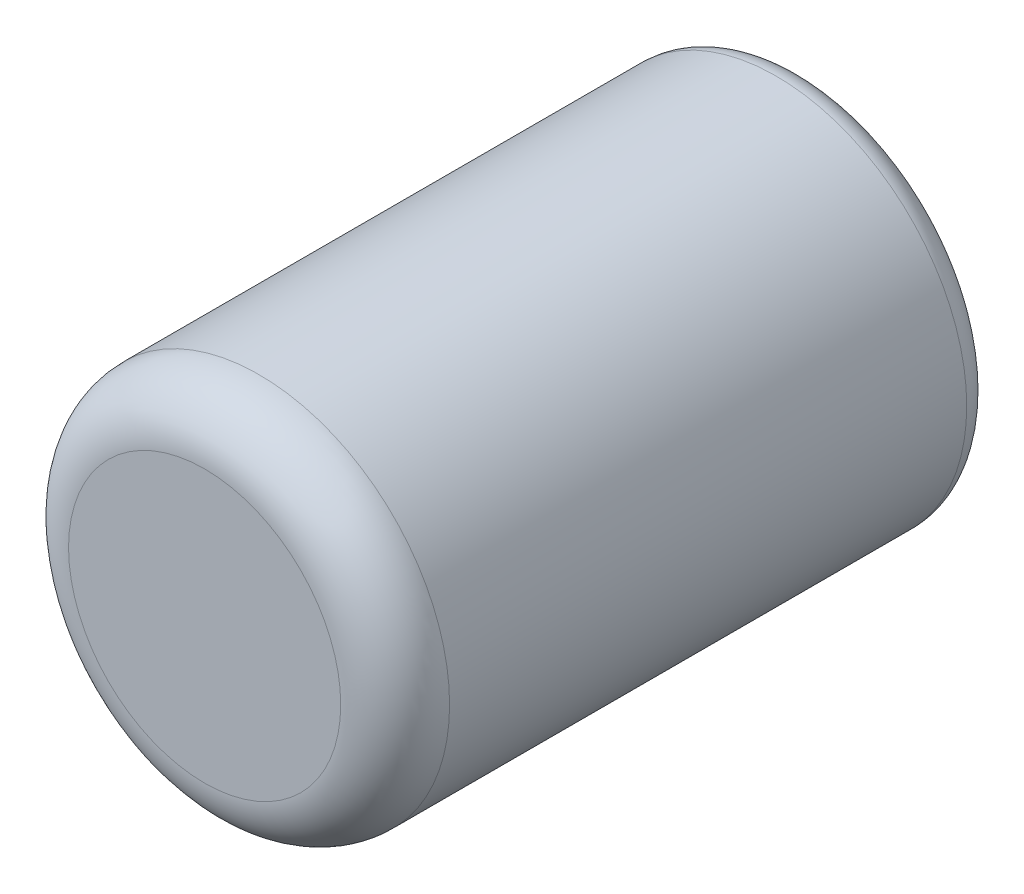
ISO-10303-21;
HEADER;
FILE_DESCRIPTION(('STEP AP214'),'2;1');
FILE_NAME('part.step','',(''),(''),'','','');
FILE_SCHEMA(('AUTOMOTIVE_DESIGN { 1 0 10303 214 1 1 1 1 }'));
ENDSEC;
DATA;
#1=APPLICATION_CONTEXT('core data for automotive mechanical design processes');
#2=APPLICATION_PROTOCOL_DEFINITION('international standard','automotive_design',2000,#1);
#3=PRODUCT_CONTEXT('',#1,'mechanical');
#4=PRODUCT('Part','Part','',(#3));
#5=PRODUCT_RELATED_PRODUCT_CATEGORY('part','',(#4));
#6=PRODUCT_DEFINITION_FORMATION('','',#4);
#7=PRODUCT_DEFINITION_CONTEXT('part definition',#1,'design');
#8=PRODUCT_DEFINITION('design','',#6,#7);
#9=PRODUCT_DEFINITION_SHAPE('','',#8);
#10=(LENGTH_UNIT() NAMED_UNIT(*) SI_UNIT(.MILLI.,.METRE.));
#11=(NAMED_UNIT(*) PLANE_ANGLE_UNIT() SI_UNIT($,.RADIAN.));
#12=(NAMED_UNIT(*) SI_UNIT($,.STERADIAN.) SOLID_ANGLE_UNIT());
#13=UNCERTAINTY_MEASURE_WITH_UNIT(LENGTH_MEASURE(1.E-05),#10,'distance_accuracy_value','');
#14=(GEOMETRIC_REPRESENTATION_CONTEXT(3) GLOBAL_UNCERTAINTY_ASSIGNED_CONTEXT((#13)) GLOBAL_UNIT_ASSIGNED_CONTEXT((#10,
#11,#12)) REPRESENTATION_CONTEXT('',''));
#15=CARTESIAN_POINT('',(0.,0.,0.));
#16=DIRECTION('',(0.,0.,1.));
#17=DIRECTION('',(1.,0.,0.));
#18=AXIS2_PLACEMENT_3D('',#15,#16,#17);
#19=CARTESIAN_POINT('',(0.,0.,0.));
#20=DIRECTION('',(0.,0.,1.));
#21=DIRECTION('',(1.,0.,0.));
#22=AXIS2_PLACEMENT_3D('',#19,#20,#21);
#23=PLANE('',#22);
#24=CARTESIAN_POINT('',(0.,0.,0.));
#25=DIRECTION('',(0.,0.,1.));
#26=DIRECTION('',(1.,0.,0.));
#27=AXIS2_PLACEMENT_3D('',#24,#25,#26);
#28=CIRCLE('',#27,6.);
#29=CARTESIAN_POINT('',(6.,0.,0.));
#30=VERTEX_POINT('',#29);
#31=EDGE_CURVE('E10',#30,#30,#28,.F.);
#32=ORIENTED_EDGE('',*,*,#31,.T.);
#33=EDGE_LOOP('',(#32));
#34=FACE_BOUND('',#33,.T.);
#35=CARTESIAN_POINT('',(0.,0.,0.));
#36=DIRECTION('',(0.,0.,1.));
#37=DIRECTION('',(1.,0.,0.));
#38=AXIS2_PLACEMENT_3D('',#35,#36,#37);
#39=CIRCLE('',#38,4.);
#40=CARTESIAN_POINT('',(4.,0.,0.));
#41=VERTEX_POINT('',#40);
#42=EDGE_CURVE('E59',#41,#41,#39,.T.);
#43=ORIENTED_EDGE('',*,*,#42,.T.);
#44=EDGE_LOOP('',(#43));
#45=FACE_BOUND('',#44,.T.);
#46=ADVANCED_FACE('F39',(#34,#45),#23,.F.);
#47=CARTESIAN_POINT('',(0.,0.,20.));
#48=DIRECTION('',(0.,0.,-1.));
#49=DIRECTION('',(-1.,0.,0.));
#50=AXIS2_PLACEMENT_3D('',#47,#48,#49);
#51=CYLINDRICAL_SURFACE('',#50,7.);
#52=CARTESIAN_POINT('',(0.,0.,1.));
#53=DIRECTION('',(0.,0.,1.));
#54=DIRECTION('',(1.,0.,0.));
#55=AXIS2_PLACEMENT_3D('',#52,#53,#54);
#56=CIRCLE('',#55,7.);
#57=CARTESIAN_POINT('',(7.,0.,1.));
#58=VERTEX_POINT('',#57);
#59=EDGE_CURVE('E46',#58,#58,#56,.T.);
#60=ORIENTED_EDGE('',*,*,#59,.T.);
#61=EDGE_LOOP('',(#60));
#62=FACE_BOUND('',#61,.T.);
#63=CARTESIAN_POINT('',(0.,0.,20.));
#64=DIRECTION('',(0.,0.,1.));
#65=DIRECTION('',(1.,0.,0.));
#66=AXIS2_PLACEMENT_3D('',#63,#64,#65);
#67=CIRCLE('',#66,7.);
#68=CARTESIAN_POINT('',(7.,0.,20.));
#69=VERTEX_POINT('',#68);
#70=EDGE_CURVE('E50',#69,#69,#67,.F.);
#71=ORIENTED_EDGE('',*,*,#70,.T.);
#72=EDGE_LOOP('',(#71));
#73=FACE_BOUND('',#72,.T.);
#74=ADVANCED_FACE('F80',(#62,#73),#51,.T.);
#75=CARTESIAN_POINT('',(0.,0.,20.));
#76=DIRECTION('',(0.,0.,-1.));
#77=DIRECTION('',(-1.,0.,0.));
#78=AXIS2_PLACEMENT_3D('',#75,#76,#77);
#79=CYLINDRICAL_SURFACE('',#78,4.);
#80=CARTESIAN_POINT('',(0.,0.,20.));
#81=DIRECTION('',(0.,0.,1.));
#82=DIRECTION('',(1.,0.,0.));
#83=AXIS2_PLACEMENT_3D('',#80,#81,#82);
#84=CIRCLE('',#83,4.);
#85=CARTESIAN_POINT('',(4.,0.,20.));
#86=VERTEX_POINT('',#85);
#87=EDGE_CURVE('E62',#86,#86,#84,.T.);
#88=ORIENTED_EDGE('',*,*,#87,.T.);
#89=EDGE_LOOP('',(#88));
#90=FACE_BOUND('',#89,.T.);
#91=ORIENTED_EDGE('',*,*,#42,.F.);
#92=EDGE_LOOP('',(#91));
#93=FACE_BOUND('',#92,.T.);
#94=ADVANCED_FACE('F66',(#90,#93),#79,.F.);
#95=CARTESIAN_POINT('',(0.,0.,20.));
#96=DIRECTION('',(0.,0.,1.));
#97=DIRECTION('',(1.,0.,0.));
#98=AXIS2_PLACEMENT_3D('',#95,#96,#97);
#99=PLANE('',#98);
#100=ORIENTED_EDGE('',*,*,#87,.F.);
#101=EDGE_LOOP('',(#100));
#102=FACE_BOUND('',#101,.T.);
#103=ADVANCED_FACE('F69',(#102),#99,.F.);
#104=CARTESIAN_POINT('',(0.,0.,22.));
#105=DIRECTION('',(0.,0.,1.));
#106=DIRECTION('',(1.,0.,0.));
#107=AXIS2_PLACEMENT_3D('',#104,#105,#106);
#108=PLANE('',#107);
#109=CARTESIAN_POINT('',(0.,0.,22.));
#110=DIRECTION('',(0.,0.,1.));
#111=DIRECTION('',(1.,0.,0.));
#112=AXIS2_PLACEMENT_3D('',#109,#110,#111);
#113=CIRCLE('',#112,5.);
#114=CARTESIAN_POINT('',(5.,0.,22.));
#115=VERTEX_POINT('',#114);
#116=EDGE_CURVE('E54',#115,#115,#113,.T.);
#117=ORIENTED_EDGE('',*,*,#116,.T.);
#118=EDGE_LOOP('',(#117));
#119=FACE_BOUND('',#118,.T.);
#120=ADVANCED_FACE('F71',(#119),#108,.T.);
#121=CARTESIAN_POINT('',(0.,0.,20.));
#122=DIRECTION('',(0.,0.,1.));
#123=DIRECTION('',(1.,0.,0.));
#124=AXIS2_PLACEMENT_3D('',#121,#122,#123);
#125=TOROIDAL_SURFACE('',#124,5.,2.);
#126=ORIENTED_EDGE('',*,*,#70,.F.);
#127=EDGE_LOOP('',(#126));
#128=FACE_BOUND('',#127,.T.);
#129=ORIENTED_EDGE('',*,*,#116,.F.);
#130=EDGE_LOOP('',(#129));
#131=FACE_BOUND('',#130,.T.);
#132=ADVANCED_FACE('F77',(#128,#131),#125,.T.);
#133=CARTESIAN_POINT('',(0.,0.,1.));
#134=DIRECTION('',(0.,0.,1.));
#135=DIRECTION('',(1.,0.,0.));
#136=AXIS2_PLACEMENT_3D('',#133,#134,#135);
#137=TOROIDAL_SURFACE('',#136,6.,1.);
#138=ORIENTED_EDGE('',*,*,#31,.F.);
#139=EDGE_LOOP('',(#138));
#140=FACE_BOUND('',#139,.T.);
#141=ORIENTED_EDGE('',*,*,#59,.F.);
#142=EDGE_LOOP('',(#141));
#143=FACE_BOUND('',#142,.T.);
#144=ADVANCED_FACE('F41',(#140,#143),#137,.T.);
#145=CLOSED_SHELL('',(#46,#74,#94,#103,#120,#132,#144));
#146=MANIFOLD_SOLID_BREP('B2',#145);
#147=ADVANCED_BREP_SHAPE_REPRESENTATION('',(#18,#146),#14);
#148=SHAPE_DEFINITION_REPRESENTATION(#9,#147);
ENDSEC;
END-ISO-10303-21;
